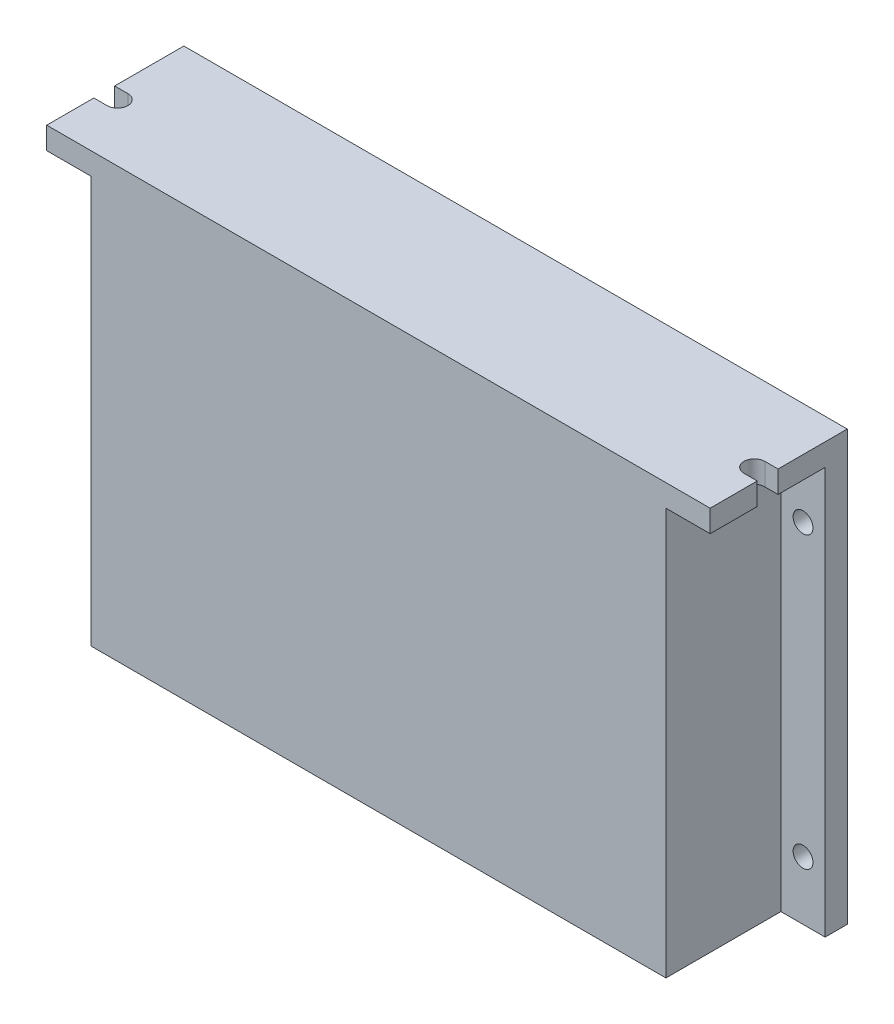
ISO-10303-21;
HEADER;
FILE_DESCRIPTION(('STEP AP214'),'2;1');
FILE_NAME('part.step','',(''),(''),'','','');
FILE_SCHEMA(('AUTOMOTIVE_DESIGN { 1 0 10303 214 1 1 1 1 }'));
ENDSEC;
DATA;
#1=APPLICATION_CONTEXT('core data for automotive mechanical design processes');
#2=APPLICATION_PROTOCOL_DEFINITION('international standard','automotive_design',2000,#1);
#3=PRODUCT_CONTEXT('',#1,'mechanical');
#4=PRODUCT('Part','Part','',(#3));
#5=PRODUCT_RELATED_PRODUCT_CATEGORY('part','',(#4));
#6=PRODUCT_DEFINITION_FORMATION('','',#4);
#7=PRODUCT_DEFINITION_CONTEXT('part definition',#1,'design');
#8=PRODUCT_DEFINITION('design','',#6,#7);
#9=PRODUCT_DEFINITION_SHAPE('','',#8);
#10=(LENGTH_UNIT() NAMED_UNIT(*) SI_UNIT(.MILLI.,.METRE.));
#11=(NAMED_UNIT(*) PLANE_ANGLE_UNIT() SI_UNIT($,.RADIAN.));
#12=(NAMED_UNIT(*) SI_UNIT($,.STERADIAN.) SOLID_ANGLE_UNIT());
#13=UNCERTAINTY_MEASURE_WITH_UNIT(LENGTH_MEASURE(1.E-05),#10,'distance_accuracy_value','');
#14=(GEOMETRIC_REPRESENTATION_CONTEXT(3) GLOBAL_UNCERTAINTY_ASSIGNED_CONTEXT((#13)) GLOBAL_UNIT_ASSIGNED_CONTEXT((#10,
#11,#12)) REPRESENTATION_CONTEXT('',''));
#15=CARTESIAN_POINT('',(0.,0.,0.));
#16=DIRECTION('',(0.,0.,1.));
#17=DIRECTION('',(1.,0.,0.));
#18=AXIS2_PLACEMENT_3D('',#15,#16,#17);
#19=CARTESIAN_POINT('',(74.9999999999999,97.,15.5));
#20=DIRECTION('',(-1.,0.,0.));
#21=DIRECTION('',(0.,0.,1.));
#22=AXIS2_PLACEMENT_3D('',#19,#20,#21);
#23=PLANE('',#22);
#24=DIRECTION('',(0.,-1.,0.));
#25=VECTOR('',#24,1.);
#26=CARTESIAN_POINT('',(75.0000000000001,106.021086409075,0.149999999999994));
#27=LINE('',#26,#25);
#28=CARTESIAN_POINT('',(75.0000000000001,97.,0.149999999999994));
#29=VERTEX_POINT('',#28);
#30=CARTESIAN_POINT('',(75.0000000000001,92.,0.149999999999994));
#31=VERTEX_POINT('',#30);
#32=EDGE_CURVE('E703',#29,#31,#27,.T.);
#33=ORIENTED_EDGE('',*,*,#32,.T.);
#34=DIRECTION('',(0.,0.,1.));
#35=VECTOR('',#34,1.);
#36=CARTESIAN_POINT('',(75.0000000000001,92.,-108.041882410074));
#37=LINE('',#36,#35);
#38=CARTESIAN_POINT('',(75.0000000000001,92.,-10.5));
#39=VERTEX_POINT('',#38);
#40=EDGE_CURVE('E233',#39,#31,#37,.T.);
#41=ORIENTED_EDGE('',*,*,#40,.F.);
#42=DIRECTION('',(0.,1.,0.));
#43=VECTOR('',#42,1.);
#44=CARTESIAN_POINT('',(75.0000000000001,0.,-10.5));
#45=LINE('',#44,#43);
#46=CARTESIAN_POINT('',(75.0000000000001,0.,-10.5));
#47=VERTEX_POINT('',#46);
#48=EDGE_CURVE('E383',#47,#39,#45,.T.);
#49=ORIENTED_EDGE('',*,*,#48,.F.);
#50=DIRECTION('',(0.,0.,-1.));
#51=VECTOR('',#50,1.);
#52=CARTESIAN_POINT('',(74.9999999999999,0.,15.5));
#53=LINE('',#52,#51);
#54=CARTESIAN_POINT('',(74.9999999999999,0.,-15.5));
#55=VERTEX_POINT('',#54);
#56=EDGE_CURVE('E336',#47,#55,#53,.T.);
#57=ORIENTED_EDGE('',*,*,#56,.T.);
#58=DIRECTION('',(0.,-1.,0.));
#59=VECTOR('',#58,1.);
#60=CARTESIAN_POINT('',(74.9999999999999,97.,-15.5));
#61=LINE('',#60,#59);
#62=CARTESIAN_POINT('',(74.9999999999999,97.,-15.5));
#63=VERTEX_POINT('',#62);
#64=EDGE_CURVE('E42',#63,#55,#61,.T.);
#65=ORIENTED_EDGE('',*,*,#64,.F.);
#66=DIRECTION('',(0.,0.,-1.));
#67=VECTOR('',#66,1.);
#68=CARTESIAN_POINT('',(74.9999999999999,97.,15.5));
#69=LINE('',#68,#67);
#70=EDGE_CURVE('E340',#29,#63,#69,.T.);
#71=ORIENTED_EDGE('',*,*,#70,.F.);
#72=EDGE_LOOP('',(#33,#41,#49,#57,#65,#71));
#73=FACE_BOUND('',#72,.T.);
#74=ADVANCED_FACE('F34',(#73),#23,.F.);
#75=DIRECTION('',(0.,-1.,0.));
#76=VECTOR('',#75,1.);
#77=CARTESIAN_POINT('',(75.0000000000001,106.021086409075,4.84999999999999));
#78=LINE('',#77,#76);
#79=CARTESIAN_POINT('',(75.0000000000001,97.,4.84999999999999));
#80=VERTEX_POINT('',#79);
#81=CARTESIAN_POINT('',(75.0000000000001,92.,4.84999999999999));
#82=VERTEX_POINT('',#81);
#83=EDGE_CURVE('E208',#80,#82,#78,.T.);
#84=ORIENTED_EDGE('',*,*,#83,.F.);
#85=CARTESIAN_POINT('',(74.9999999999999,97.,15.5));
#86=VERTEX_POINT('',#85);
#87=EDGE_CURVE('E337',#86,#80,#69,.T.);
#88=ORIENTED_EDGE('',*,*,#87,.F.);
#89=DIRECTION('',(0.,-1.,0.));
#90=VECTOR('',#89,1.);
#91=CARTESIAN_POINT('',(74.9999999999999,97.,15.5));
#92=LINE('',#91,#90);
#93=CARTESIAN_POINT('',(75.0000000000001,92.,15.5));
#94=VERTEX_POINT('',#93);
#95=EDGE_CURVE('E232',#86,#94,#92,.T.);
#96=ORIENTED_EDGE('',*,*,#95,.T.);
#97=EDGE_CURVE('E225',#82,#94,#37,.T.);
#98=ORIENTED_EDGE('',*,*,#97,.F.);
#99=EDGE_LOOP('',(#84,#88,#96,#98));
#100=FACE_BOUND('',#99,.T.);
#101=ADVANCED_FACE('F230',(#100),#23,.F.);
#102=CARTESIAN_POINT('',(-75.0000000000001,97.,15.5));
#103=DIRECTION('',(1.,0.,0.));
#104=DIRECTION('',(0.,0.,-1.));
#105=AXIS2_PLACEMENT_3D('',#102,#103,#104);
#106=PLANE('',#105);
#107=DIRECTION('',(0.,0.,1.));
#108=VECTOR('',#107,1.);
#109=CARTESIAN_POINT('',(-75.0000000000001,97.,15.5));
#110=LINE('',#109,#108);
#111=CARTESIAN_POINT('',(-75.0000000000001,97.,4.84999999999999));
#112=VERTEX_POINT('',#111);
#113=CARTESIAN_POINT('',(-75.0000000000001,97.,15.5));
#114=VERTEX_POINT('',#113);
#115=EDGE_CURVE('E342',#112,#114,#110,.T.);
#116=ORIENTED_EDGE('',*,*,#115,.F.);
#117=DIRECTION('',(0.,-1.,0.));
#118=VECTOR('',#117,1.);
#119=CARTESIAN_POINT('',(-75.0000000000001,106.021086409075,4.84999999999999));
#120=LINE('',#119,#118);
#121=CARTESIAN_POINT('',(-75.0000000000001,92.,4.84999999999999));
#122=VERTEX_POINT('',#121);
#123=EDGE_CURVE('E715',#112,#122,#120,.T.);
#124=ORIENTED_EDGE('',*,*,#123,.T.);
#125=DIRECTION('',(0.,0.,1.));
#126=VECTOR('',#125,1.);
#127=CARTESIAN_POINT('',(-75.0000000000001,92.,-108.041882410074));
#128=LINE('',#127,#126);
#129=CARTESIAN_POINT('',(-75.0000000000001,92.,15.5));
#130=VERTEX_POINT('',#129);
#131=EDGE_CURVE('E272',#122,#130,#128,.T.);
#132=ORIENTED_EDGE('',*,*,#131,.T.);
#133=DIRECTION('',(0.,-1.,0.));
#134=VECTOR('',#133,1.);
#135=CARTESIAN_POINT('',(-75.0000000000001,97.,15.5));
#136=LINE('',#135,#134);
#137=EDGE_CURVE('E359',#114,#130,#136,.T.);
#138=ORIENTED_EDGE('',*,*,#137,.F.);
#139=EDGE_LOOP('',(#116,#124,#132,#138));
#140=FACE_BOUND('',#139,.T.);
#141=ADVANCED_FACE('F456',(#140),#106,.F.);
#142=CARTESIAN_POINT('',(-75.0000000000001,97.,15.5));
#143=DIRECTION('',(0.,0.,-1.));
#144=DIRECTION('',(-1.,0.,0.));
#145=AXIS2_PLACEMENT_3D('',#142,#143,#144);
#146=PLANE('',#145);
#147=DIRECTION('',(1.,0.,0.));
#148=VECTOR('',#147,1.);
#149=CARTESIAN_POINT('',(75.0000000000001,92.,15.5));
#150=LINE('',#149,#148);
#151=CARTESIAN_POINT('',(65.0000000000001,92.,15.5));
#152=VERTEX_POINT('',#151);
#153=EDGE_CURVE('E239',#152,#94,#150,.T.);
#154=ORIENTED_EDGE('',*,*,#153,.T.);
#155=ORIENTED_EDGE('',*,*,#95,.F.);
#156=DIRECTION('',(1.,0.,0.));
#157=VECTOR('',#156,1.);
#158=CARTESIAN_POINT('',(-75.0000000000001,97.,15.5));
#159=LINE('',#158,#157);
#160=EDGE_CURVE('E346',#114,#86,#159,.T.);
#161=ORIENTED_EDGE('',*,*,#160,.F.);
#162=ORIENTED_EDGE('',*,*,#137,.T.);
#163=DIRECTION('',(-1.,0.,0.));
#164=VECTOR('',#163,1.);
#165=CARTESIAN_POINT('',(-75.0000000000001,92.,15.5));
#166=LINE('',#165,#164);
#167=CARTESIAN_POINT('',(-65.0000000000001,92.,15.5));
#168=VERTEX_POINT('',#167);
#169=EDGE_CURVE('E266',#168,#130,#166,.T.);
#170=ORIENTED_EDGE('',*,*,#169,.F.);
#171=DIRECTION('',(0.,1.,0.));
#172=VECTOR('',#171,1.);
#173=CARTESIAN_POINT('',(-65.0000000000001,0.,15.5));
#174=LINE('',#173,#172);
#175=CARTESIAN_POINT('',(-65.0000000000001,0.,15.5));
#176=VERTEX_POINT('',#175);
#177=EDGE_CURVE('E252',#176,#168,#174,.T.);
#178=ORIENTED_EDGE('',*,*,#177,.F.);
#179=DIRECTION('',(1.,0.,0.));
#180=VECTOR('',#179,1.);
#181=CARTESIAN_POINT('',(-75.0000000000001,0.,15.5));
#182=LINE('',#181,#180);
#183=CARTESIAN_POINT('',(65.0000000000001,0.,15.5));
#184=VERTEX_POINT('',#183);
#185=EDGE_CURVE('E355',#176,#184,#182,.T.);
#186=ORIENTED_EDGE('',*,*,#185,.T.);
#187=DIRECTION('',(0.,1.,0.));
#188=VECTOR('',#187,1.);
#189=CARTESIAN_POINT('',(65.0000000000001,0.,15.5));
#190=LINE('',#189,#188);
#191=EDGE_CURVE('E234',#184,#152,#190,.T.);
#192=ORIENTED_EDGE('',*,*,#191,.T.);
#193=EDGE_LOOP('',(#154,#155,#161,#162,#170,#178,#186,#192));
#194=FACE_BOUND('',#193,.T.);
#195=ADVANCED_FACE('F420',(#194),#146,.F.);
#196=CARTESIAN_POINT('',(0.,0.,0.));
#197=DIRECTION('',(0.,-1.,0.));
#198=DIRECTION('',(0.,0.,-1.));
#199=AXIS2_PLACEMENT_3D('',#196,#197,#198);
#200=PLANE('',#199);
#201=DIRECTION('',(1.,0.,0.));
#202=VECTOR('',#201,1.);
#203=CARTESIAN_POINT('',(75.0000000000001,0.,-10.5));
#204=LINE('',#203,#202);
#205=CARTESIAN_POINT('',(65.0000000000001,0.,-10.5));
#206=VERTEX_POINT('',#205);
#207=EDGE_CURVE('E734',#206,#47,#204,.T.);
#208=ORIENTED_EDGE('',*,*,#207,.F.);
#209=DIRECTION('',(0.,0.,1.));
#210=VECTOR('',#209,1.);
#211=CARTESIAN_POINT('',(65.0000000000001,0.,-108.041882410074));
#212=LINE('',#211,#210);
#213=EDGE_CURVE('E248',#206,#184,#212,.T.);
#214=ORIENTED_EDGE('',*,*,#213,.T.);
#215=ORIENTED_EDGE('',*,*,#185,.F.);
#216=DIRECTION('',(0.,0.,1.));
#217=VECTOR('',#216,1.);
#218=CARTESIAN_POINT('',(-65.0000000000001,0.,-108.041882410074));
#219=LINE('',#218,#217);
#220=CARTESIAN_POINT('',(-65.0000000000001,0.,-10.5));
#221=VERTEX_POINT('',#220);
#222=EDGE_CURVE('E269',#221,#176,#219,.T.);
#223=ORIENTED_EDGE('',*,*,#222,.F.);
#224=DIRECTION('',(-1.,0.,0.));
#225=VECTOR('',#224,1.);
#226=CARTESIAN_POINT('',(-75.0000000000001,0.,-10.5));
#227=LINE('',#226,#225);
#228=CARTESIAN_POINT('',(-75.0000000000001,0.,-10.5));
#229=VERTEX_POINT('',#228);
#230=EDGE_CURVE('E262',#221,#229,#227,.T.);
#231=ORIENTED_EDGE('',*,*,#230,.T.);
#232=DIRECTION('',(0.,0.,1.));
#233=VECTOR('',#232,1.);
#234=CARTESIAN_POINT('',(-75.0000000000001,0.,15.5));
#235=LINE('',#234,#233);
#236=CARTESIAN_POINT('',(-75.0000000000001,0.,-15.5));
#237=VERTEX_POINT('',#236);
#238=EDGE_CURVE('E352',#237,#229,#235,.T.);
#239=ORIENTED_EDGE('',*,*,#238,.F.);
#240=DIRECTION('',(-1.,0.,0.));
#241=VECTOR('',#240,1.);
#242=CARTESIAN_POINT('',(-75.0000000000001,0.,-15.5));
#243=LINE('',#242,#241);
#244=EDGE_CURVE('E349',#55,#237,#243,.T.);
#245=ORIENTED_EDGE('',*,*,#244,.F.);
#246=ORIENTED_EDGE('',*,*,#56,.F.);
#247=EDGE_LOOP('',(#208,#214,#215,#223,#231,#239,#245,#246));
#248=FACE_BOUND('',#247,.T.);
#249=ADVANCED_FACE('F386',(#248),#200,.T.);
#250=CARTESIAN_POINT('',(69.9999999999999,13.25,-15.5));
#251=DIRECTION('',(0.,0.,1.));
#252=DIRECTION('',(1.,0.,0.));
#253=AXIS2_PLACEMENT_3D('',#250,#251,#252);
#254=CYLINDRICAL_SURFACE('',#253,2.25);
#255=CARTESIAN_POINT('',(69.9999999999999,13.25,-15.5));
#256=DIRECTION('',(0.,0.,1.));
#257=DIRECTION('',(1.,0.,0.));
#258=AXIS2_PLACEMENT_3D('',#255,#256,#257);
#259=CIRCLE('',#258,2.25);
#260=CARTESIAN_POINT('',(72.2499999999999,13.25,-15.5));
#261=VERTEX_POINT('',#260);
#262=EDGE_CURVE('E313',#261,#261,#259,.T.);
#263=ORIENTED_EDGE('',*,*,#262,.F.);
#264=EDGE_LOOP('',(#263));
#265=FACE_BOUND('',#264,.T.);
#266=CARTESIAN_POINT('',(69.9999999999999,13.25,-10.5));
#267=DIRECTION('',(0.,0.,1.));
#268=DIRECTION('',(1.,0.,0.));
#269=AXIS2_PLACEMENT_3D('',#266,#267,#268);
#270=CIRCLE('',#269,2.25);
#271=CARTESIAN_POINT('',(72.2499999999999,13.25,-10.5));
#272=VERTEX_POINT('',#271);
#273=EDGE_CURVE('E249',#272,#272,#270,.F.);
#274=ORIENTED_EDGE('',*,*,#273,.F.);
#275=EDGE_LOOP('',(#274));
#276=FACE_BOUND('',#275,.T.);
#277=ADVANCED_FACE('F473',(#265,#276),#254,.F.);
#278=CARTESIAN_POINT('',(69.9999999999999,78.75,-15.5));
#279=DIRECTION('',(0.,0.,1.));
#280=DIRECTION('',(1.,0.,0.));
#281=AXIS2_PLACEMENT_3D('',#278,#279,#280);
#282=CYLINDRICAL_SURFACE('',#281,2.25);
#283=CARTESIAN_POINT('',(69.9999999999999,78.75,-15.5));
#284=DIRECTION('',(0.,0.,1.));
#285=DIRECTION('',(1.,0.,0.));
#286=AXIS2_PLACEMENT_3D('',#283,#284,#285);
#287=CIRCLE('',#286,2.25);
#288=CARTESIAN_POINT('',(72.2499999999999,78.75,-15.5));
#289=VERTEX_POINT('',#288);
#290=EDGE_CURVE('E310',#289,#289,#287,.T.);
#291=ORIENTED_EDGE('',*,*,#290,.F.);
#292=EDGE_LOOP('',(#291));
#293=FACE_BOUND('',#292,.T.);
#294=CARTESIAN_POINT('',(69.9999999999999,78.75,-10.5));
#295=DIRECTION('',(0.,0.,1.));
#296=DIRECTION('',(1.,0.,0.));
#297=AXIS2_PLACEMENT_3D('',#294,#295,#296);
#298=CIRCLE('',#297,2.25);
#299=CARTESIAN_POINT('',(72.2499999999999,78.75,-10.5));
#300=VERTEX_POINT('',#299);
#301=EDGE_CURVE('E37',#300,#300,#298,.F.);
#302=ORIENTED_EDGE('',*,*,#301,.F.);
#303=EDGE_LOOP('',(#302));
#304=FACE_BOUND('',#303,.T.);
#305=ADVANCED_FACE('F469',(#293,#304),#282,.F.);
#306=DIRECTION('',(0.,1.,0.));
#307=VECTOR('',#306,1.);
#308=CARTESIAN_POINT('',(-75.0000000000001,0.,-10.5));
#309=LINE('',#308,#307);
#310=CARTESIAN_POINT('',(-75.0000000000001,15.5,-10.5));
#311=VERTEX_POINT('',#310);
#312=CARTESIAN_POINT('',(-75.0000000000001,76.5,-10.5));
#313=VERTEX_POINT('',#312);
#314=EDGE_CURVE('E263',#311,#313,#309,.T.);
#315=ORIENTED_EDGE('',*,*,#314,.T.);
#316=DIRECTION('',(0.,0.,1.));
#317=VECTOR('',#316,1.);
#318=CARTESIAN_POINT('',(-75.0000000000001,76.5,-15.5));
#319=LINE('',#318,#317);
#320=CARTESIAN_POINT('',(-75.0000000000001,76.5,-15.5));
#321=VERTEX_POINT('',#320);
#322=EDGE_CURVE('E297',#321,#313,#319,.T.);
#323=ORIENTED_EDGE('',*,*,#322,.F.);
#324=DIRECTION('',(0.,-1.,0.));
#325=VECTOR('',#324,1.);
#326=CARTESIAN_POINT('',(-75.0000000000001,97.,-15.5));
#327=LINE('',#326,#325);
#328=CARTESIAN_POINT('',(-75.0000000000001,15.5,-15.5));
#329=VERTEX_POINT('',#328);
#330=EDGE_CURVE('E366',#321,#329,#327,.T.);
#331=ORIENTED_EDGE('',*,*,#330,.T.);
#332=DIRECTION('',(0.,0.,1.));
#333=VECTOR('',#332,1.);
#334=CARTESIAN_POINT('',(-75.0000000000001,15.5,-15.5));
#335=LINE('',#334,#333);
#336=EDGE_CURVE('E314',#329,#311,#335,.T.);
#337=ORIENTED_EDGE('',*,*,#336,.T.);
#338=EDGE_LOOP('',(#315,#323,#331,#337));
#339=FACE_BOUND('',#338,.T.);
#340=ADVANCED_FACE('F397',(#339),#106,.F.);
#341=CARTESIAN_POINT('',(-75.0000000000001,10.8,-10.5));
#342=VERTEX_POINT('',#341);
#343=EDGE_CURVE('E259',#229,#342,#309,.T.);
#344=ORIENTED_EDGE('',*,*,#343,.T.);
#345=DIRECTION('',(0.,0.,1.));
#346=VECTOR('',#345,1.);
#347=CARTESIAN_POINT('',(-75.0000000000001,10.8,-15.5));
#348=LINE('',#347,#346);
#349=CARTESIAN_POINT('',(-75.0000000000001,10.8,-15.5));
#350=VERTEX_POINT('',#349);
#351=EDGE_CURVE('E323',#350,#342,#348,.T.);
#352=ORIENTED_EDGE('',*,*,#351,.F.);
#353=EDGE_CURVE('E362',#350,#237,#327,.T.);
#354=ORIENTED_EDGE('',*,*,#353,.T.);
#355=ORIENTED_EDGE('',*,*,#238,.T.);
#356=EDGE_LOOP('',(#344,#352,#354,#355));
#357=FACE_BOUND('',#356,.T.);
#358=ADVANCED_FACE('F390',(#357),#106,.F.);
#359=CARTESIAN_POINT('',(-75.0000000000001,81.2,-15.5));
#360=DIRECTION('',(0.,1.,0.));
#361=DIRECTION('',(0.,0.,1.));
#362=AXIS2_PLACEMENT_3D('',#359,#360,#361);
#363=PLANE('',#362);
#364=DIRECTION('',(1.,0.,0.));
#365=VECTOR('',#364,1.);
#366=CARTESIAN_POINT('',(-75.0000000000001,81.2,-10.5));
#367=LINE('',#366,#365);
#368=CARTESIAN_POINT('',(-75.0000000000001,81.2,-10.5));
#369=VERTEX_POINT('',#368);
#370=CARTESIAN_POINT('',(-72.0000000000001,81.2,-10.5));
#371=VERTEX_POINT('',#370);
#372=EDGE_CURVE('E286',#369,#371,#367,.T.);
#373=ORIENTED_EDGE('',*,*,#372,.F.);
#374=DIRECTION('',(0.,0.,1.));
#375=VECTOR('',#374,1.);
#376=CARTESIAN_POINT('',(-75.0000000000001,81.2,-15.5));
#377=LINE('',#376,#375);
#378=CARTESIAN_POINT('',(-75.0000000000001,81.2,-15.5));
#379=VERTEX_POINT('',#378);
#380=EDGE_CURVE('E298',#379,#369,#377,.T.);
#381=ORIENTED_EDGE('',*,*,#380,.F.);
#382=DIRECTION('',(-1.,0.,0.));
#383=VECTOR('',#382,1.);
#384=CARTESIAN_POINT('',(-75.0000000000001,81.2,-15.5));
#385=LINE('',#384,#383);
#386=CARTESIAN_POINT('',(-72.0000000000001,81.2,-15.5));
#387=VERTEX_POINT('',#386);
#388=EDGE_CURVE('E294',#387,#379,#385,.T.);
#389=ORIENTED_EDGE('',*,*,#388,.F.);
#390=DIRECTION('',(0.,0.,1.));
#391=VECTOR('',#390,1.);
#392=CARTESIAN_POINT('',(-72.0000000000001,81.2,-15.5));
#393=LINE('',#392,#391);
#394=EDGE_CURVE('E302',#387,#371,#393,.T.);
#395=ORIENTED_EDGE('',*,*,#394,.T.);
#396=EDGE_LOOP('',(#373,#381,#389,#395));
#397=FACE_BOUND('',#396,.T.);
#398=ADVANCED_FACE('F433',(#397),#363,.F.);
#399=CARTESIAN_POINT('',(-72.0000000000001,78.85,-15.5));
#400=DIRECTION('',(0.,0.,1.));
#401=DIRECTION('',(1.,0.,0.));
#402=AXIS2_PLACEMENT_3D('',#399,#400,#401);
#403=CYLINDRICAL_SURFACE('',#402,2.34999999999999);
#404=CARTESIAN_POINT('',(-72.0000000000001,78.85,-10.5));
#405=DIRECTION('',(0.,0.,1.));
#406=DIRECTION('',(1.,0.,0.));
#407=AXIS2_PLACEMENT_3D('',#404,#405,#406);
#408=CIRCLE('',#407,2.34999999999999);
#409=CARTESIAN_POINT('',(-72.0000000000001,76.5,-10.5));
#410=VERTEX_POINT('',#409);
#411=EDGE_CURVE('E284',#371,#410,#408,.F.);
#412=ORIENTED_EDGE('',*,*,#411,.F.);
#413=ORIENTED_EDGE('',*,*,#394,.F.);
#414=CARTESIAN_POINT('',(-72.0000000000001,78.85,-15.5));
#415=DIRECTION('',(0.,0.,1.));
#416=DIRECTION('',(1.,0.,0.));
#417=AXIS2_PLACEMENT_3D('',#414,#415,#416);
#418=CIRCLE('',#417,2.34999999999999);
#419=CARTESIAN_POINT('',(-72.0000000000001,76.5,-15.5));
#420=VERTEX_POINT('',#419);
#421=EDGE_CURVE('E291',#420,#387,#418,.T.);
#422=ORIENTED_EDGE('',*,*,#421,.F.);
#423=DIRECTION('',(0.,0.,1.));
#424=VECTOR('',#423,1.);
#425=CARTESIAN_POINT('',(-72.0000000000001,76.5,-15.5));
#426=LINE('',#425,#424);
#427=EDGE_CURVE('E305',#420,#410,#426,.T.);
#428=ORIENTED_EDGE('',*,*,#427,.T.);
#429=EDGE_LOOP('',(#412,#413,#422,#428));
#430=FACE_BOUND('',#429,.T.);
#431=ADVANCED_FACE('F439',(#430),#403,.F.);
#432=CARTESIAN_POINT('',(-75.0000000000001,76.5,-15.5));
#433=DIRECTION('',(0.,-1.,0.));
#434=DIRECTION('',(0.,0.,-1.));
#435=AXIS2_PLACEMENT_3D('',#432,#433,#434);
#436=PLANE('',#435);
#437=DIRECTION('',(-1.,0.,0.));
#438=VECTOR('',#437,1.);
#439=CARTESIAN_POINT('',(-75.0000000000001,76.5,-10.5));
#440=LINE('',#439,#438);
#441=EDGE_CURVE('E282',#410,#313,#440,.T.);
#442=ORIENTED_EDGE('',*,*,#441,.F.);
#443=ORIENTED_EDGE('',*,*,#427,.F.);
#444=DIRECTION('',(1.,0.,0.));
#445=VECTOR('',#444,1.);
#446=CARTESIAN_POINT('',(-75.0000000000001,76.5,-15.5));
#447=LINE('',#446,#445);
#448=EDGE_CURVE('E288',#321,#420,#447,.T.);
#449=ORIENTED_EDGE('',*,*,#448,.F.);
#450=ORIENTED_EDGE('',*,*,#322,.T.);
#451=EDGE_LOOP('',(#442,#443,#449,#450));
#452=FACE_BOUND('',#451,.T.);
#453=ADVANCED_FACE('F442',(#452),#436,.F.);
#454=CARTESIAN_POINT('',(-75.0000000000001,15.5,-15.5));
#455=DIRECTION('',(0.,1.,0.));
#456=DIRECTION('',(0.,0.,1.));
#457=AXIS2_PLACEMENT_3D('',#454,#455,#456);
#458=PLANE('',#457);
#459=DIRECTION('',(1.,0.,0.));
#460=VECTOR('',#459,1.);
#461=CARTESIAN_POINT('',(-75.0000000000001,15.5,-10.5));
#462=LINE('',#461,#460);
#463=CARTESIAN_POINT('',(-72.0000000000001,15.5,-10.5));
#464=VERTEX_POINT('',#463);
#465=EDGE_CURVE('E280',#311,#464,#462,.T.);
#466=ORIENTED_EDGE('',*,*,#465,.F.);
#467=ORIENTED_EDGE('',*,*,#336,.F.);
#468=DIRECTION('',(-1.,0.,0.));
#469=VECTOR('',#468,1.);
#470=CARTESIAN_POINT('',(-75.0000000000001,15.5,-15.5));
#471=LINE('',#470,#469);
#472=CARTESIAN_POINT('',(-72.0000000000001,15.5,-15.5));
#473=VERTEX_POINT('',#472);
#474=EDGE_CURVE('E320',#473,#329,#471,.T.);
#475=ORIENTED_EDGE('',*,*,#474,.F.);
#476=DIRECTION('',(0.,0.,1.));
#477=VECTOR('',#476,1.);
#478=CARTESIAN_POINT('',(-72.0000000000001,15.5,-15.5));
#479=LINE('',#478,#477);
#480=EDGE_CURVE('E326',#473,#464,#479,.T.);
#481=ORIENTED_EDGE('',*,*,#480,.T.);
#482=EDGE_LOOP('',(#466,#467,#475,#481));
#483=FACE_BOUND('',#482,.T.);
#484=ADVANCED_FACE('F402',(#483),#458,.F.);
#485=CARTESIAN_POINT('',(-72.0000000000001,13.15,-15.5));
#486=DIRECTION('',(0.,0.,1.));
#487=DIRECTION('',(1.,0.,0.));
#488=AXIS2_PLACEMENT_3D('',#485,#486,#487);
#489=CYLINDRICAL_SURFACE('',#488,2.35);
#490=CARTESIAN_POINT('',(-72.0000000000001,13.15,-10.5));
#491=DIRECTION('',(0.,0.,1.));
#492=DIRECTION('',(1.,0.,0.));
#493=AXIS2_PLACEMENT_3D('',#490,#491,#492);
#494=CIRCLE('',#493,2.35);
#495=CARTESIAN_POINT('',(-72.0000000000001,10.8,-10.5));
#496=VERTEX_POINT('',#495);
#497=EDGE_CURVE('E278',#464,#496,#494,.F.);
#498=ORIENTED_EDGE('',*,*,#497,.F.);
#499=ORIENTED_EDGE('',*,*,#480,.F.);
#500=CARTESIAN_POINT('',(-72.0000000000001,13.15,-15.5));
#501=DIRECTION('',(0.,0.,1.));
#502=DIRECTION('',(1.,0.,0.));
#503=AXIS2_PLACEMENT_3D('',#500,#501,#502);
#504=CIRCLE('',#503,2.35);
#505=CARTESIAN_POINT('',(-72.0000000000001,10.8,-15.5));
#506=VERTEX_POINT('',#505);
#507=EDGE_CURVE('E317',#506,#473,#504,.T.);
#508=ORIENTED_EDGE('',*,*,#507,.F.);
#509=DIRECTION('',(0.,0.,1.));
#510=VECTOR('',#509,1.);
#511=CARTESIAN_POINT('',(-72.0000000000001,10.8,-15.5));
#512=LINE('',#511,#510);
#513=EDGE_CURVE('E329',#506,#496,#512,.T.);
#514=ORIENTED_EDGE('',*,*,#513,.T.);
#515=EDGE_LOOP('',(#498,#499,#508,#514));
#516=FACE_BOUND('',#515,.T.);
#517=ADVANCED_FACE('F408',(#516),#489,.F.);
#518=CARTESIAN_POINT('',(-75.0000000000001,10.8,-15.5));
#519=DIRECTION('',(0.,-1.,0.));
#520=DIRECTION('',(0.,0.,-1.));
#521=AXIS2_PLACEMENT_3D('',#518,#519,#520);
#522=PLANE('',#521);
#523=DIRECTION('',(-1.,0.,0.));
#524=VECTOR('',#523,1.);
#525=CARTESIAN_POINT('',(-75.0000000000001,10.8,-10.5));
#526=LINE('',#525,#524);
#527=EDGE_CURVE('E12',#496,#342,#526,.T.);
#528=ORIENTED_EDGE('',*,*,#527,.F.);
#529=ORIENTED_EDGE('',*,*,#513,.F.);
#530=DIRECTION('',(1.,0.,0.));
#531=VECTOR('',#530,1.);
#532=CARTESIAN_POINT('',(-75.0000000000001,10.8,-15.5));
#533=LINE('',#532,#531);
#534=EDGE_CURVE('E301',#350,#506,#533,.T.);
#535=ORIENTED_EDGE('',*,*,#534,.F.);
#536=ORIENTED_EDGE('',*,*,#351,.T.);
#537=EDGE_LOOP('',(#528,#529,#535,#536));
#538=FACE_BOUND('',#537,.T.);
#539=ADVANCED_FACE('F410',(#538),#522,.F.);
#540=CARTESIAN_POINT('',(-75.0000000000001,92.,-10.5));
#541=VERTEX_POINT('',#540);
#542=CARTESIAN_POINT('',(-75.0000000000001,92.,0.149999999999997));
#543=VERTEX_POINT('',#542);
#544=EDGE_CURVE('E256',#541,#543,#128,.T.);
#545=ORIENTED_EDGE('',*,*,#544,.T.);
#546=DIRECTION('',(0.,-1.,0.));
#547=VECTOR('',#546,1.);
#548=CARTESIAN_POINT('',(-75.0000000000001,106.021086409075,0.149999999999994));
#549=LINE('',#548,#547);
#550=CARTESIAN_POINT('',(-75.0000000000001,97.,0.149999999999994));
#551=VERTEX_POINT('',#550);
#552=EDGE_CURVE('E57',#551,#543,#549,.T.);
#553=ORIENTED_EDGE('',*,*,#552,.F.);
#554=CARTESIAN_POINT('',(-75.0000000000001,97.,-15.5));
#555=VERTEX_POINT('',#554);
#556=EDGE_CURVE('E343',#555,#551,#110,.T.);
#557=ORIENTED_EDGE('',*,*,#556,.F.);
#558=EDGE_CURVE('E363',#555,#379,#327,.T.);
#559=ORIENTED_EDGE('',*,*,#558,.T.);
#560=ORIENTED_EDGE('',*,*,#380,.T.);
#561=EDGE_CURVE('E258',#369,#541,#309,.T.);
#562=ORIENTED_EDGE('',*,*,#561,.T.);
#563=EDGE_LOOP('',(#545,#553,#557,#559,#560,#562));
#564=FACE_BOUND('',#563,.T.);
#565=ADVANCED_FACE('F435',(#564),#106,.F.);
#566=CARTESIAN_POINT('',(-75.0000000000001,97.,-15.5));
#567=DIRECTION('',(0.,0.,1.));
#568=DIRECTION('',(1.,0.,0.));
#569=AXIS2_PLACEMENT_3D('',#566,#567,#568);
#570=PLANE('',#569);
#571=ORIENTED_EDGE('',*,*,#290,.T.);
#572=EDGE_LOOP('',(#571));
#573=FACE_BOUND('',#572,.T.);
#574=ORIENTED_EDGE('',*,*,#262,.T.);
#575=EDGE_LOOP('',(#574));
#576=FACE_BOUND('',#575,.T.);
#577=ORIENTED_EDGE('',*,*,#507,.T.);
#578=ORIENTED_EDGE('',*,*,#474,.T.);
#579=ORIENTED_EDGE('',*,*,#330,.F.);
#580=ORIENTED_EDGE('',*,*,#448,.T.);
#581=ORIENTED_EDGE('',*,*,#421,.T.);
#582=ORIENTED_EDGE('',*,*,#388,.T.);
#583=ORIENTED_EDGE('',*,*,#558,.F.);
#584=DIRECTION('',(-1.,0.,0.));
#585=VECTOR('',#584,1.);
#586=CARTESIAN_POINT('',(-75.0000000000001,97.,-15.5));
#587=LINE('',#586,#585);
#588=EDGE_CURVE('E339',#63,#555,#587,.T.);
#589=ORIENTED_EDGE('',*,*,#588,.F.);
#590=ORIENTED_EDGE('',*,*,#64,.T.);
#591=ORIENTED_EDGE('',*,*,#244,.T.);
#592=ORIENTED_EDGE('',*,*,#353,.F.);
#593=ORIENTED_EDGE('',*,*,#534,.T.);
#594=EDGE_LOOP('',(#577,#578,#579,#580,#581,#582,#583,#589,#590,#591,#592,#593));
#595=FACE_BOUND('',#594,.T.);
#596=ADVANCED_FACE('F371',(#573,#576,#595),#570,.F.);
#597=CARTESIAN_POINT('',(0.,97.,0.));
#598=DIRECTION('',(0.,-1.,0.));
#599=DIRECTION('',(0.,0.,-1.));
#600=AXIS2_PLACEMENT_3D('',#597,#598,#599);
#601=PLANE('',#600);
#602=DIRECTION('',(-1.,0.,0.));
#603=VECTOR('',#602,1.);
#604=CARTESIAN_POINT('',(75.0000000000001,97.,4.84999999999999));
#605=LINE('',#604,#603);
#606=CARTESIAN_POINT('',(72.0000000000001,97.,4.84999999999999));
#607=VERTEX_POINT('',#606);
#608=EDGE_CURVE('E214',#80,#607,#605,.T.);
#609=ORIENTED_EDGE('',*,*,#608,.T.);
#610=CARTESIAN_POINT('',(72.0000000000001,97.,2.49999999999999));
#611=DIRECTION('',(0.,-1.,0.));
#612=DIRECTION('',(0.,0.,-1.));
#613=AXIS2_PLACEMENT_3D('',#610,#611,#612);
#614=CIRCLE('',#613,2.35);
#615=CARTESIAN_POINT('',(72.0000000000001,97.,0.149999999999994));
#616=VERTEX_POINT('',#615);
#617=EDGE_CURVE('E711',#607,#616,#614,.T.);
#618=ORIENTED_EDGE('',*,*,#617,.T.);
#619=DIRECTION('',(1.,0.,0.));
#620=VECTOR('',#619,1.);
#621=CARTESIAN_POINT('',(75.0000000000001,97.,0.149999999999994));
#622=LINE('',#621,#620);
#623=EDGE_CURVE('E701',#616,#29,#622,.T.);
#624=ORIENTED_EDGE('',*,*,#623,.T.);
#625=ORIENTED_EDGE('',*,*,#70,.T.);
#626=ORIENTED_EDGE('',*,*,#588,.T.);
#627=ORIENTED_EDGE('',*,*,#556,.T.);
#628=DIRECTION('',(-1.,0.,0.));
#629=VECTOR('',#628,1.);
#630=CARTESIAN_POINT('',(-75.0000000000001,97.,0.149999999999994));
#631=LINE('',#630,#629);
#632=CARTESIAN_POINT('',(-72.0000000000001,97.,0.149999999999994));
#633=VERTEX_POINT('',#632);
#634=EDGE_CURVE('E717',#633,#551,#631,.T.);
#635=ORIENTED_EDGE('',*,*,#634,.F.);
#636=CARTESIAN_POINT('',(-72.0000000000001,97.,2.49999999999999));
#637=DIRECTION('',(0.,-1.,0.));
#638=DIRECTION('',(0.,0.,-1.));
#639=AXIS2_PLACEMENT_3D('',#636,#637,#638);
#640=CIRCLE('',#639,2.35);
#641=CARTESIAN_POINT('',(-72.0000000000001,97.,4.84999999999999));
#642=VERTEX_POINT('',#641);
#643=EDGE_CURVE('E712',#642,#633,#640,.F.);
#644=ORIENTED_EDGE('',*,*,#643,.F.);
#645=DIRECTION('',(1.,0.,0.));
#646=VECTOR('',#645,1.);
#647=CARTESIAN_POINT('',(-75.0000000000001,97.,4.84999999999999));
#648=LINE('',#647,#646);
#649=EDGE_CURVE('E714',#112,#642,#648,.T.);
#650=ORIENTED_EDGE('',*,*,#649,.F.);
#651=ORIENTED_EDGE('',*,*,#115,.T.);
#652=ORIENTED_EDGE('',*,*,#160,.T.);
#653=ORIENTED_EDGE('',*,*,#87,.T.);
#654=EDGE_LOOP('',(#609,#618,#624,#625,#626,#627,#635,#644,#650,#651,#652,#653));
#655=FACE_BOUND('',#654,.T.);
#656=ADVANCED_FACE('F480',(#655),#601,.F.);
#657=CARTESIAN_POINT('',(-75.0000000000001,97.,-10.5));
#658=DIRECTION('',(0.,0.,1.));
#659=DIRECTION('',(1.,0.,0.));
#660=AXIS2_PLACEMENT_3D('',#657,#658,#659);
#661=PLANE('',#660);
#662=ORIENTED_EDGE('',*,*,#372,.T.);
#663=ORIENTED_EDGE('',*,*,#411,.T.);
#664=ORIENTED_EDGE('',*,*,#441,.T.);
#665=ORIENTED_EDGE('',*,*,#314,.F.);
#666=ORIENTED_EDGE('',*,*,#465,.T.);
#667=ORIENTED_EDGE('',*,*,#497,.T.);
#668=ORIENTED_EDGE('',*,*,#527,.T.);
#669=ORIENTED_EDGE('',*,*,#343,.F.);
#670=ORIENTED_EDGE('',*,*,#230,.F.);
#671=DIRECTION('',(0.,-1.,0.));
#672=VECTOR('',#671,1.);
#673=CARTESIAN_POINT('',(-65.0000000000001,0.,-10.5));
#674=LINE('',#673,#672);
#675=CARTESIAN_POINT('',(-65.0000000000001,92.,-10.5));
#676=VERTEX_POINT('',#675);
#677=EDGE_CURVE('E253',#676,#221,#674,.T.);
#678=ORIENTED_EDGE('',*,*,#677,.F.);
#679=DIRECTION('',(1.,0.,0.));
#680=VECTOR('',#679,1.);
#681=CARTESIAN_POINT('',(-75.0000000000001,92.,-10.5));
#682=LINE('',#681,#680);
#683=EDGE_CURVE('E255',#541,#676,#682,.T.);
#684=ORIENTED_EDGE('',*,*,#683,.F.);
#685=ORIENTED_EDGE('',*,*,#561,.F.);
#686=EDGE_LOOP('',(#662,#663,#664,#665,#666,#667,#668,#669,#670,#678,#684,#685));
#687=FACE_BOUND('',#686,.T.);
#688=ADVANCED_FACE('F405',(#687),#661,.T.);
#689=CARTESIAN_POINT('',(-75.0000000000001,92.,-108.041882410074));
#690=DIRECTION('',(0.,1.,0.));
#691=DIRECTION('',(0.,0.,1.));
#692=AXIS2_PLACEMENT_3D('',#689,#690,#691);
#693=PLANE('',#692);
#694=ORIENTED_EDGE('',*,*,#131,.F.);
#695=DIRECTION('',(-1.,0.,0.));
#696=VECTOR('',#695,1.);
#697=CARTESIAN_POINT('',(-75.0000000000001,92.,4.84999999999999));
#698=LINE('',#697,#696);
#699=CARTESIAN_POINT('',(-72.0000000000001,92.,4.84999999999999));
#700=VERTEX_POINT('',#699);
#701=EDGE_CURVE('E723',#700,#122,#698,.T.);
#702=ORIENTED_EDGE('',*,*,#701,.F.);
#703=CARTESIAN_POINT('',(-72.0000000000001,92.,2.49999999999999));
#704=DIRECTION('',(0.,-1.,0.));
#705=DIRECTION('',(0.,0.,-1.));
#706=AXIS2_PLACEMENT_3D('',#703,#704,#705);
#707=CIRCLE('',#706,2.35);
#708=CARTESIAN_POINT('',(-72.0000000000001,92.,0.149999999999994));
#709=VERTEX_POINT('',#708);
#710=EDGE_CURVE('E720',#709,#700,#707,.T.);
#711=ORIENTED_EDGE('',*,*,#710,.F.);
#712=DIRECTION('',(1.,0.,0.));
#713=VECTOR('',#712,1.);
#714=CARTESIAN_POINT('',(-75.0000000000001,92.,0.149999999999994));
#715=LINE('',#714,#713);
#716=EDGE_CURVE('E718',#543,#709,#715,.T.);
#717=ORIENTED_EDGE('',*,*,#716,.F.);
#718=ORIENTED_EDGE('',*,*,#544,.F.);
#719=ORIENTED_EDGE('',*,*,#683,.T.);
#720=DIRECTION('',(0.,0.,1.));
#721=VECTOR('',#720,1.);
#722=CARTESIAN_POINT('',(-65.0000000000001,92.,-108.041882410074));
#723=LINE('',#722,#721);
#724=EDGE_CURVE('E273',#676,#168,#723,.T.);
#725=ORIENTED_EDGE('',*,*,#724,.T.);
#726=ORIENTED_EDGE('',*,*,#169,.T.);
#727=EDGE_LOOP('',(#694,#702,#711,#717,#718,#719,#725,#726));
#728=FACE_BOUND('',#727,.T.);
#729=ADVANCED_FACE('F425',(#728),#693,.F.);
#730=CARTESIAN_POINT('',(-65.0000000000001,0.,-108.041882410074));
#731=DIRECTION('',(1.,0.,0.));
#732=DIRECTION('',(0.,0.,-1.));
#733=AXIS2_PLACEMENT_3D('',#730,#731,#732);
#734=PLANE('',#733);
#735=ORIENTED_EDGE('',*,*,#677,.T.);
#736=ORIENTED_EDGE('',*,*,#222,.T.);
#737=ORIENTED_EDGE('',*,*,#177,.T.);
#738=ORIENTED_EDGE('',*,*,#724,.F.);
#739=EDGE_LOOP('',(#735,#736,#737,#738));
#740=FACE_BOUND('',#739,.T.);
#741=ADVANCED_FACE('F417',(#740),#734,.F.);
#742=CARTESIAN_POINT('',(-75.0000000000001,97.,-10.5));
#743=DIRECTION('',(0.,0.,1.));
#744=DIRECTION('',(1.,0.,0.));
#745=AXIS2_PLACEMENT_3D('',#742,#743,#744);
#746=PLANE('',#745);
#747=ORIENTED_EDGE('',*,*,#207,.T.);
#748=ORIENTED_EDGE('',*,*,#48,.T.);
#749=DIRECTION('',(-1.,0.,0.));
#750=VECTOR('',#749,1.);
#751=CARTESIAN_POINT('',(75.0000000000001,92.,-10.5));
#752=LINE('',#751,#750);
#753=CARTESIAN_POINT('',(65.0000000000001,92.,-10.5));
#754=VERTEX_POINT('',#753);
#755=EDGE_CURVE('E244',#39,#754,#752,.T.);
#756=ORIENTED_EDGE('',*,*,#755,.T.);
#757=DIRECTION('',(0.,-1.,0.));
#758=VECTOR('',#757,1.);
#759=CARTESIAN_POINT('',(65.0000000000001,0.,-10.5));
#760=LINE('',#759,#758);
#761=EDGE_CURVE('E247',#754,#206,#760,.T.);
#762=ORIENTED_EDGE('',*,*,#761,.T.);
#763=EDGE_LOOP('',(#747,#748,#756,#762));
#764=FACE_BOUND('',#763,.T.);
#765=ORIENTED_EDGE('',*,*,#301,.T.);
#766=EDGE_LOOP('',(#765));
#767=FACE_BOUND('',#766,.T.);
#768=ORIENTED_EDGE('',*,*,#273,.T.);
#769=EDGE_LOOP('',(#768));
#770=FACE_BOUND('',#769,.T.);
#771=ADVANCED_FACE('F513',(#764,#767,#770),#746,.T.);
#772=CARTESIAN_POINT('',(75.0000000000001,92.,-108.041882410074));
#773=DIRECTION('',(0.,-1.,0.));
#774=DIRECTION('',(0.,0.,-1.));
#775=AXIS2_PLACEMENT_3D('',#772,#773,#774);
#776=PLANE('',#775);
#777=CARTESIAN_POINT('',(72.0000000000001,92.,2.49999999999999));
#778=DIRECTION('',(0.,1.,0.));
#779=DIRECTION('',(0.,0.,-1.));
#780=AXIS2_PLACEMENT_3D('',#777,#778,#779);
#781=CIRCLE('',#780,2.35);
#782=CARTESIAN_POINT('',(72.0000000000001,92.,0.149999999999997));
#783=VERTEX_POINT('',#782);
#784=CARTESIAN_POINT('',(72.0000000000001,92.,4.84999999999999));
#785=VERTEX_POINT('',#784);
#786=EDGE_CURVE('E49',#783,#785,#781,.T.);
#787=ORIENTED_EDGE('',*,*,#786,.T.);
#788=DIRECTION('',(1.,0.,0.));
#789=VECTOR('',#788,1.);
#790=CARTESIAN_POINT('',(75.0000000000001,92.,4.84999999999999));
#791=LINE('',#790,#789);
#792=EDGE_CURVE('E212',#785,#82,#791,.T.);
#793=ORIENTED_EDGE('',*,*,#792,.T.);
#794=ORIENTED_EDGE('',*,*,#97,.T.);
#795=ORIENTED_EDGE('',*,*,#153,.F.);
#796=DIRECTION('',(0.,0.,1.));
#797=VECTOR('',#796,1.);
#798=CARTESIAN_POINT('',(65.0000000000001,92.,-108.041882410074));
#799=LINE('',#798,#797);
#800=EDGE_CURVE('E237',#754,#152,#799,.T.);
#801=ORIENTED_EDGE('',*,*,#800,.F.);
#802=ORIENTED_EDGE('',*,*,#755,.F.);
#803=ORIENTED_EDGE('',*,*,#40,.T.);
#804=DIRECTION('',(-1.,0.,0.));
#805=VECTOR('',#804,1.);
#806=CARTESIAN_POINT('',(75.0000000000001,92.,0.149999999999994));
#807=LINE('',#806,#805);
#808=EDGE_CURVE('E220',#31,#783,#807,.T.);
#809=ORIENTED_EDGE('',*,*,#808,.T.);
#810=EDGE_LOOP('',(#787,#793,#794,#795,#801,#802,#803,#809));
#811=FACE_BOUND('',#810,.T.);
#812=ADVANCED_FACE('F223',(#811),#776,.T.);
#813=CARTESIAN_POINT('',(65.0000000000001,0.,-108.041882410074));
#814=DIRECTION('',(1.,0.,0.));
#815=DIRECTION('',(0.,0.,-1.));
#816=AXIS2_PLACEMENT_3D('',#813,#814,#815);
#817=PLANE('',#816);
#818=ORIENTED_EDGE('',*,*,#800,.T.);
#819=ORIENTED_EDGE('',*,*,#191,.F.);
#820=ORIENTED_EDGE('',*,*,#213,.F.);
#821=ORIENTED_EDGE('',*,*,#761,.F.);
#822=EDGE_LOOP('',(#818,#819,#820,#821));
#823=FACE_BOUND('',#822,.T.);
#824=ADVANCED_FACE('F527',(#823),#817,.T.);
#825=CARTESIAN_POINT('',(-75.0000000000001,106.021086409075,4.84999999999999));
#826=DIRECTION('',(0.,0.,1.));
#827=DIRECTION('',(1.,0.,0.));
#828=AXIS2_PLACEMENT_3D('',#825,#826,#827);
#829=PLANE('',#828);
#830=ORIENTED_EDGE('',*,*,#649,.T.);
#831=DIRECTION('',(0.,-1.,0.));
#832=VECTOR('',#831,1.);
#833=CARTESIAN_POINT('',(-72.0000000000001,106.021086409075,4.84999999999999));
#834=LINE('',#833,#832);
#835=EDGE_CURVE('E727',#642,#700,#834,.T.);
#836=ORIENTED_EDGE('',*,*,#835,.T.);
#837=ORIENTED_EDGE('',*,*,#701,.T.);
#838=ORIENTED_EDGE('',*,*,#123,.F.);
#839=EDGE_LOOP('',(#830,#836,#837,#838));
#840=FACE_BOUND('',#839,.T.);
#841=ADVANCED_FACE('F531',(#840),#829,.F.);
#842=CARTESIAN_POINT('',(-72.0000000000001,106.021086409075,2.49999999999999));
#843=DIRECTION('',(0.,-1.,0.));
#844=DIRECTION('',(0.,0.,-1.));
#845=AXIS2_PLACEMENT_3D('',#842,#843,#844);
#846=CYLINDRICAL_SURFACE('',#845,2.35);
#847=ORIENTED_EDGE('',*,*,#643,.T.);
#848=DIRECTION('',(0.,-1.,0.));
#849=VECTOR('',#848,1.);
#850=CARTESIAN_POINT('',(-72.0000000000001,106.021086409075,0.149999999999994));
#851=LINE('',#850,#849);
#852=EDGE_CURVE('E729',#633,#709,#851,.T.);
#853=ORIENTED_EDGE('',*,*,#852,.T.);
#854=ORIENTED_EDGE('',*,*,#710,.T.);
#855=ORIENTED_EDGE('',*,*,#835,.F.);
#856=EDGE_LOOP('',(#847,#853,#854,#855));
#857=FACE_BOUND('',#856,.T.);
#858=ADVANCED_FACE('F562',(#857),#846,.F.);
#859=CARTESIAN_POINT('',(-75.0000000000001,106.021086409075,0.149999999999994));
#860=DIRECTION('',(0.,0.,-1.));
#861=DIRECTION('',(-1.,0.,0.));
#862=AXIS2_PLACEMENT_3D('',#859,#860,#861);
#863=PLANE('',#862);
#864=ORIENTED_EDGE('',*,*,#634,.T.);
#865=ORIENTED_EDGE('',*,*,#552,.T.);
#866=ORIENTED_EDGE('',*,*,#716,.T.);
#867=ORIENTED_EDGE('',*,*,#852,.F.);
#868=EDGE_LOOP('',(#864,#865,#866,#867));
#869=FACE_BOUND('',#868,.T.);
#870=ADVANCED_FACE('F572',(#869),#863,.F.);
#871=CARTESIAN_POINT('',(75.0000000000001,106.021086409075,4.84999999999999));
#872=DIRECTION('',(0.,0.,-1.));
#873=DIRECTION('',(-1.,0.,0.));
#874=AXIS2_PLACEMENT_3D('',#871,#872,#873);
#875=PLANE('',#874);
#876=ORIENTED_EDGE('',*,*,#83,.T.);
#877=ORIENTED_EDGE('',*,*,#792,.F.);
#878=DIRECTION('',(0.,-1.,0.));
#879=VECTOR('',#878,1.);
#880=CARTESIAN_POINT('',(72.0000000000001,106.021086409075,4.84999999999999));
#881=LINE('',#880,#879);
#882=EDGE_CURVE('E219',#607,#785,#881,.T.);
#883=ORIENTED_EDGE('',*,*,#882,.F.);
#884=ORIENTED_EDGE('',*,*,#608,.F.);
#885=EDGE_LOOP('',(#876,#877,#883,#884));
#886=FACE_BOUND('',#885,.T.);
#887=ADVANCED_FACE('F210',(#886),#875,.T.);
#888=CARTESIAN_POINT('',(72.0000000000001,106.021086409075,2.49999999999999));
#889=DIRECTION('',(0.,-1.,0.));
#890=DIRECTION('',(0.,0.,-1.));
#891=AXIS2_PLACEMENT_3D('',#888,#889,#890);
#892=CYLINDRICAL_SURFACE('',#891,2.35);
#893=ORIENTED_EDGE('',*,*,#882,.T.);
#894=ORIENTED_EDGE('',*,*,#786,.F.);
#895=DIRECTION('',(0.,-1.,0.));
#896=VECTOR('',#895,1.);
#897=CARTESIAN_POINT('',(72.0000000000001,106.021086409075,0.149999999999994));
#898=LINE('',#897,#896);
#899=EDGE_CURVE('E699',#616,#783,#898,.T.);
#900=ORIENTED_EDGE('',*,*,#899,.F.);
#901=ORIENTED_EDGE('',*,*,#617,.F.);
#902=EDGE_LOOP('',(#893,#894,#900,#901));
#903=FACE_BOUND('',#902,.T.);
#904=ADVANCED_FACE('F610',(#903),#892,.F.);
#905=CARTESIAN_POINT('',(75.0000000000001,106.021086409075,0.149999999999994));
#906=DIRECTION('',(0.,0.,1.));
#907=DIRECTION('',(1.,0.,0.));
#908=AXIS2_PLACEMENT_3D('',#905,#906,#907);
#909=PLANE('',#908);
#910=ORIENTED_EDGE('',*,*,#899,.T.);
#911=ORIENTED_EDGE('',*,*,#808,.F.);
#912=ORIENTED_EDGE('',*,*,#32,.F.);
#913=ORIENTED_EDGE('',*,*,#623,.F.);
#914=EDGE_LOOP('',(#910,#911,#912,#913));
#915=FACE_BOUND('',#914,.T.);
#916=ADVANCED_FACE('F619',(#915),#909,.T.);
#917=CLOSED_SHELL('',(#74,#101,#141,#195,#249,#277,#305,#340,#358,#398,#431,#453,#484,#517,#539,
#565,#596,#656,#688,#729,#741,#771,#812,#824,#841,#858,#870,#887,#904,#916));
#918=MANIFOLD_SOLID_BREP('B2',#917);
#919=ADVANCED_BREP_SHAPE_REPRESENTATION('',(#18,#918),#14);
#920=SHAPE_DEFINITION_REPRESENTATION(#9,#919);
ENDSEC;
END-ISO-10303-21;
